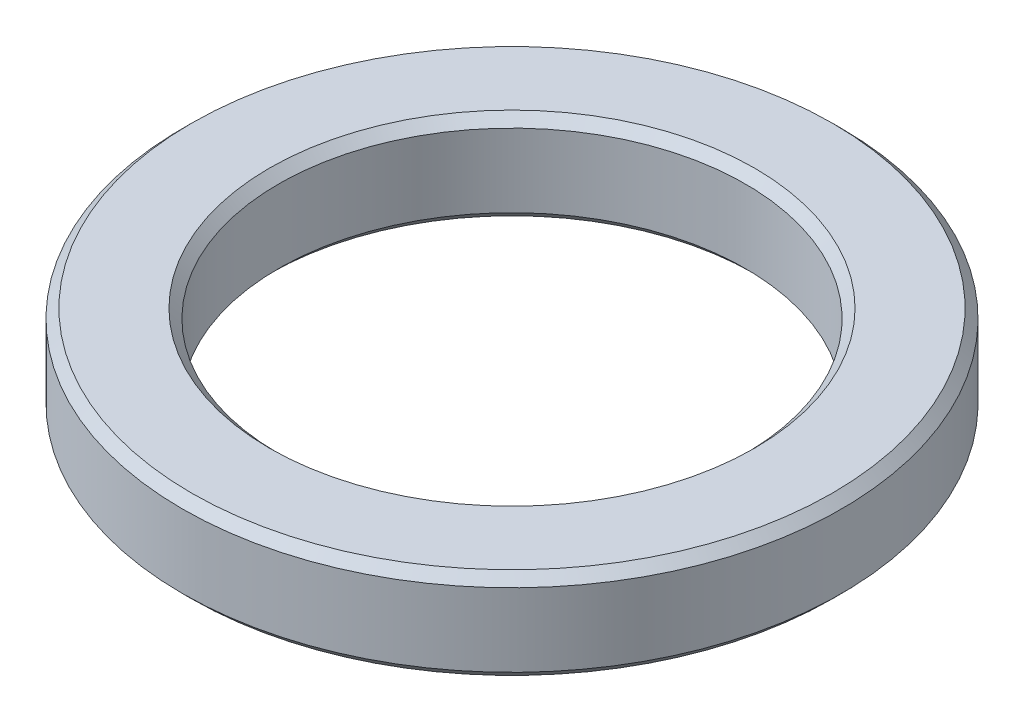
ISO-10303-21;
HEADER;
FILE_DESCRIPTION(('STEP AP214'),'2;1');
FILE_NAME('part.step','',(''),(''),'','','');
FILE_SCHEMA(('AUTOMOTIVE_DESIGN { 1 0 10303 214 1 1 1 1 }'));
ENDSEC;
DATA;
#1=APPLICATION_CONTEXT('core data for automotive mechanical design processes');
#2=APPLICATION_PROTOCOL_DEFINITION('international standard','automotive_design',2000,#1);
#3=PRODUCT_CONTEXT('',#1,'mechanical');
#4=PRODUCT('Part','Part','',(#3));
#5=PRODUCT_RELATED_PRODUCT_CATEGORY('part','',(#4));
#6=PRODUCT_DEFINITION_FORMATION('','',#4);
#7=PRODUCT_DEFINITION_CONTEXT('part definition',#1,'design');
#8=PRODUCT_DEFINITION('design','',#6,#7);
#9=PRODUCT_DEFINITION_SHAPE('','',#8);
#10=(LENGTH_UNIT() NAMED_UNIT(*) SI_UNIT(.MILLI.,.METRE.));
#11=(NAMED_UNIT(*) PLANE_ANGLE_UNIT() SI_UNIT($,.RADIAN.));
#12=(NAMED_UNIT(*) SI_UNIT($,.STERADIAN.) SOLID_ANGLE_UNIT());
#13=UNCERTAINTY_MEASURE_WITH_UNIT(LENGTH_MEASURE(1.E-05),#10,'distance_accuracy_value','');
#14=(GEOMETRIC_REPRESENTATION_CONTEXT(3) GLOBAL_UNCERTAINTY_ASSIGNED_CONTEXT((#13)) GLOBAL_UNIT_ASSIGNED_CONTEXT((#10,
#11,#12)) REPRESENTATION_CONTEXT('',''));
#15=CARTESIAN_POINT('',(0.,0.,0.));
#16=DIRECTION('',(0.,0.,1.));
#17=DIRECTION('',(1.,0.,0.));
#18=AXIS2_PLACEMENT_3D('',#15,#16,#17);
#19=CARTESIAN_POINT('',(0.,5.,0.));
#20=DIRECTION('',(0.,1.,0.));
#21=DIRECTION('',(0.,0.,1.));
#22=AXIS2_PLACEMENT_3D('',#19,#20,#21);
#23=PLANE('',#22);
#24=CARTESIAN_POINT('',(0.,5.,0.));
#25=DIRECTION('',(0.,1.,0.));
#26=DIRECTION('',(0.,0.,1.));
#27=AXIS2_PLACEMENT_3D('',#24,#25,#26);
#28=CIRCLE('',#27,17.5);
#29=CARTESIAN_POINT('',(0.,5.,17.5));
#30=VERTEX_POINT('',#29);
#31=EDGE_CURVE('E53',#30,#30,#28,.T.);
#32=ORIENTED_EDGE('',*,*,#31,.T.);
#33=EDGE_LOOP('',(#32));
#34=FACE_BOUND('',#33,.T.);
#35=CARTESIAN_POINT('',(0.,5.,0.));
#36=DIRECTION('',(0.,1.,0.));
#37=DIRECTION('',(0.,0.,1.));
#38=AXIS2_PLACEMENT_3D('',#35,#36,#37);
#39=CIRCLE('',#38,13.25);
#40=CARTESIAN_POINT('',(0.,5.,13.25));
#41=VERTEX_POINT('',#40);
#42=EDGE_CURVE('E57',#41,#41,#39,.F.);
#43=ORIENTED_EDGE('',*,*,#42,.T.);
#44=EDGE_LOOP('',(#43));
#45=FACE_BOUND('',#44,.T.);
#46=ADVANCED_FACE('F41',(#34,#45),#23,.T.);
#47=CARTESIAN_POINT('',(0.,0.,0.));
#48=DIRECTION('',(0.,1.,0.));
#49=DIRECTION('',(0.,0.,1.));
#50=AXIS2_PLACEMENT_3D('',#47,#48,#49);
#51=PLANE('',#50);
#52=CARTESIAN_POINT('',(0.,0.,0.));
#53=DIRECTION('',(0.,1.,0.));
#54=DIRECTION('',(0.,0.,1.));
#55=AXIS2_PLACEMENT_3D('',#52,#53,#54);
#56=CIRCLE('',#55,17.5);
#57=CARTESIAN_POINT('',(0.,0.,17.5));
#58=VERTEX_POINT('',#57);
#59=EDGE_CURVE('E62',#58,#58,#56,.F.);
#60=ORIENTED_EDGE('',*,*,#59,.T.);
#61=EDGE_LOOP('',(#60));
#62=FACE_BOUND('',#61,.T.);
#63=CARTESIAN_POINT('',(0.,0.,0.));
#64=DIRECTION('',(0.,1.,0.));
#65=DIRECTION('',(0.,0.,1.));
#66=AXIS2_PLACEMENT_3D('',#63,#64,#65);
#67=CIRCLE('',#66,13.25);
#68=CARTESIAN_POINT('',(0.,0.,13.25));
#69=VERTEX_POINT('',#68);
#70=EDGE_CURVE('E65',#69,#69,#67,.T.);
#71=ORIENTED_EDGE('',*,*,#70,.T.);
#72=EDGE_LOOP('',(#71));
#73=FACE_BOUND('',#72,.T.);
#74=ADVANCED_FACE('F87',(#62,#73),#51,.F.);
#75=CARTESIAN_POINT('',(0.,5.,0.));
#76=DIRECTION('',(0.,-1.,0.));
#77=DIRECTION('',(0.,0.,-1.));
#78=AXIS2_PLACEMENT_3D('',#75,#76,#77);
#79=CYLINDRICAL_SURFACE('',#78,18.);
#80=CARTESIAN_POINT('',(0.,0.499999999999997,0.));
#81=DIRECTION('',(0.,1.,0.));
#82=DIRECTION('',(0.,0.,1.));
#83=AXIS2_PLACEMENT_3D('',#80,#81,#82);
#84=CIRCLE('',#83,18.);
#85=CARTESIAN_POINT('',(0.,0.499999999999997,18.));
#86=VERTEX_POINT('',#85);
#87=EDGE_CURVE('E68',#86,#86,#84,.T.);
#88=ORIENTED_EDGE('',*,*,#87,.T.);
#89=EDGE_LOOP('',(#88));
#90=FACE_BOUND('',#89,.T.);
#91=CARTESIAN_POINT('',(0.,4.49999999999999,0.));
#92=DIRECTION('',(0.,1.,0.));
#93=DIRECTION('',(0.,0.,1.));
#94=AXIS2_PLACEMENT_3D('',#91,#92,#93);
#95=CIRCLE('',#94,18.);
#96=CARTESIAN_POINT('',(0.,4.49999999999999,18.));
#97=VERTEX_POINT('',#96);
#98=EDGE_CURVE('E71',#97,#97,#95,.F.);
#99=ORIENTED_EDGE('',*,*,#98,.T.);
#100=EDGE_LOOP('',(#99));
#101=FACE_BOUND('',#100,.T.);
#102=ADVANCED_FACE('F75',(#90,#101),#79,.T.);
#103=CARTESIAN_POINT('',(0.,5.,0.));
#104=DIRECTION('',(0.,-1.,0.));
#105=DIRECTION('',(0.,0.,-1.));
#106=AXIS2_PLACEMENT_3D('',#103,#104,#105);
#107=CYLINDRICAL_SURFACE('',#106,12.75);
#108=CARTESIAN_POINT('',(0.,0.500000000000002,0.));
#109=DIRECTION('',(0.,1.,0.));
#110=DIRECTION('',(0.,0.,1.));
#111=AXIS2_PLACEMENT_3D('',#108,#109,#110);
#112=CIRCLE('',#111,12.75);
#113=CARTESIAN_POINT('',(0.,0.500000000000002,12.75));
#114=VERTEX_POINT('',#113);
#115=EDGE_CURVE('E10',#114,#114,#112,.F.);
#116=ORIENTED_EDGE('',*,*,#115,.T.);
#117=EDGE_LOOP('',(#116));
#118=FACE_BOUND('',#117,.T.);
#119=CARTESIAN_POINT('',(0.,4.5,0.));
#120=DIRECTION('',(0.,1.,0.));
#121=DIRECTION('',(0.,0.,1.));
#122=AXIS2_PLACEMENT_3D('',#119,#120,#121);
#123=CIRCLE('',#122,12.75);
#124=CARTESIAN_POINT('',(0.,4.5,12.75));
#125=VERTEX_POINT('',#124);
#126=EDGE_CURVE('E49',#125,#125,#123,.T.);
#127=ORIENTED_EDGE('',*,*,#126,.T.);
#128=EDGE_LOOP('',(#127));
#129=FACE_BOUND('',#128,.T.);
#130=ADVANCED_FACE('F112',(#118,#129),#107,.F.);
#131=CARTESIAN_POINT('',(0.,0.499999999999997,0.));
#132=DIRECTION('',(0.,1.,0.));
#133=DIRECTION('',(0.,0.,1.));
#134=AXIS2_PLACEMENT_3D('',#131,#132,#133);
#135=CONICAL_SURFACE('',#134,18.,0.785398163397452);
#136=ORIENTED_EDGE('',*,*,#59,.F.);
#137=EDGE_LOOP('',(#136));
#138=FACE_BOUND('',#137,.T.);
#139=ORIENTED_EDGE('',*,*,#87,.F.);
#140=EDGE_LOOP('',(#139));
#141=FACE_BOUND('',#140,.T.);
#142=ADVANCED_FACE('F81',(#138,#141),#135,.T.);
#143=CARTESIAN_POINT('',(0.,5.,0.));
#144=DIRECTION('',(0.,-1.,0.));
#145=DIRECTION('',(0.,0.,-1.));
#146=AXIS2_PLACEMENT_3D('',#143,#144,#145);
#147=CONICAL_SURFACE('',#146,17.5,0.785398163397448);
#148=ORIENTED_EDGE('',*,*,#98,.F.);
#149=EDGE_LOOP('',(#148));
#150=FACE_BOUND('',#149,.T.);
#151=ORIENTED_EDGE('',*,*,#31,.F.);
#152=EDGE_LOOP('',(#151));
#153=FACE_BOUND('',#152,.T.);
#154=ADVANCED_FACE('F77',(#150,#153),#147,.T.);
#155=CARTESIAN_POINT('',(0.,0.,0.));
#156=DIRECTION('',(0.,-1.,0.));
#157=DIRECTION('',(0.,0.,-1.));
#158=AXIS2_PLACEMENT_3D('',#155,#156,#157);
#159=CONICAL_SURFACE('',#158,13.25,0.785398163397448);
#160=ORIENTED_EDGE('',*,*,#115,.F.);
#161=EDGE_LOOP('',(#160));
#162=FACE_BOUND('',#161,.T.);
#163=ORIENTED_EDGE('',*,*,#70,.F.);
#164=EDGE_LOOP('',(#163));
#165=FACE_BOUND('',#164,.T.);
#166=ADVANCED_FACE('F80',(#162,#165),#159,.F.);
#167=CARTESIAN_POINT('',(0.,4.5,0.));
#168=DIRECTION('',(0.,1.,0.));
#169=DIRECTION('',(0.,0.,1.));
#170=AXIS2_PLACEMENT_3D('',#167,#168,#169);
#171=CONICAL_SURFACE('',#170,12.75,0.785398163397447);
#172=ORIENTED_EDGE('',*,*,#42,.F.);
#173=EDGE_LOOP('',(#172));
#174=FACE_BOUND('',#173,.T.);
#175=ORIENTED_EDGE('',*,*,#126,.F.);
#176=EDGE_LOOP('',(#175));
#177=FACE_BOUND('',#176,.T.);
#178=ADVANCED_FACE('F44',(#174,#177),#171,.F.);
#179=CLOSED_SHELL('',(#46,#74,#102,#130,#142,#154,#166,#178));
#180=MANIFOLD_SOLID_BREP('B2',#179);
#181=ADVANCED_BREP_SHAPE_REPRESENTATION('',(#18,#180),#14);
#182=SHAPE_DEFINITION_REPRESENTATION(#9,#181);
ENDSEC;
END-ISO-10303-21;
